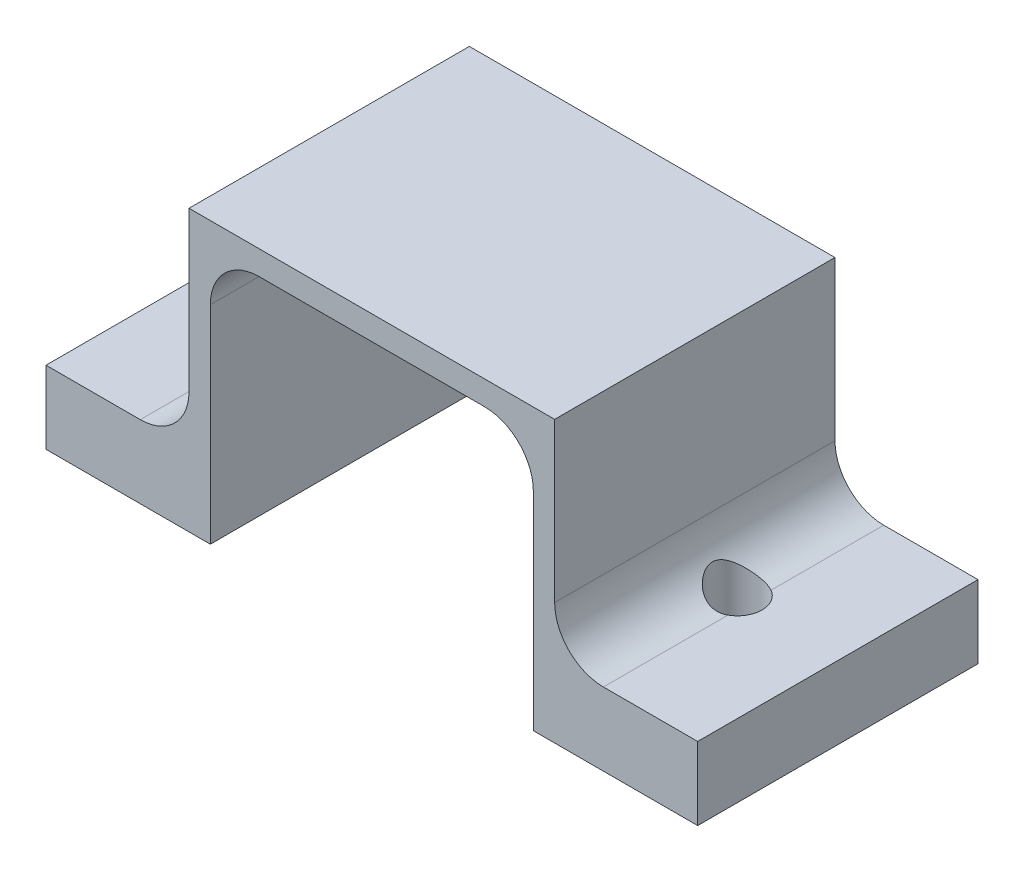
ISO-10303-21;
HEADER;
FILE_DESCRIPTION(('STEP AP214'),'2;1');
FILE_NAME('part.step','',(''),(''),'','','');
FILE_SCHEMA(('AUTOMOTIVE_DESIGN { 1 0 10303 214 1 1 1 1 }'));
ENDSEC;
DATA;
#1=APPLICATION_CONTEXT('core data for automotive mechanical design processes');
#2=APPLICATION_PROTOCOL_DEFINITION('international standard','automotive_design',2000,#1);
#3=PRODUCT_CONTEXT('',#1,'mechanical');
#4=PRODUCT('Part','Part','',(#3));
#5=PRODUCT_RELATED_PRODUCT_CATEGORY('part','',(#4));
#6=PRODUCT_DEFINITION_FORMATION('','',#4);
#7=PRODUCT_DEFINITION_CONTEXT('part definition',#1,'design');
#8=PRODUCT_DEFINITION('design','',#6,#7);
#9=PRODUCT_DEFINITION_SHAPE('','',#8);
#10=(LENGTH_UNIT() NAMED_UNIT(*) SI_UNIT(.MILLI.,.METRE.));
#11=(NAMED_UNIT(*) PLANE_ANGLE_UNIT() SI_UNIT($,.RADIAN.));
#12=(NAMED_UNIT(*) SI_UNIT($,.STERADIAN.) SOLID_ANGLE_UNIT());
#13=UNCERTAINTY_MEASURE_WITH_UNIT(LENGTH_MEASURE(1.E-05),#10,'distance_accuracy_value','');
#14=(GEOMETRIC_REPRESENTATION_CONTEXT(3) GLOBAL_UNCERTAINTY_ASSIGNED_CONTEXT((#13)) GLOBAL_UNIT_ASSIGNED_CONTEXT((#10,
#11,#12)) REPRESENTATION_CONTEXT('',''));
#15=CARTESIAN_POINT('',(0.,0.,0.));
#16=DIRECTION('',(0.,0.,1.));
#17=DIRECTION('',(1.,0.,0.));
#18=AXIS2_PLACEMENT_3D('',#15,#16,#17);
#19=CARTESIAN_POINT('',(4.62528628462516,6.5868047316279,11.5));
#20=DIRECTION('',(0.,0.,-1.));
#21=DIRECTION('',(-1.,0.,0.));
#22=AXIS2_PLACEMENT_3D('',#19,#20,#21);
#23=CYLINDRICAL_SURFACE('',#22,2.);
#24=CARTESIAN_POINT('',(4.62528628462516,6.5868047316279,0.));
#25=DIRECTION('',(0.,0.,1.));
#26=DIRECTION('',(1.,0.,0.));
#27=AXIS2_PLACEMENT_3D('',#24,#25,#26);
#28=CIRCLE('',#27,2.);
#29=CARTESIAN_POINT('',(6.62528628462516,6.5868047316279,0.));
#30=VERTEX_POINT('',#29);
#31=CARTESIAN_POINT('',(4.62528628462515,8.5868047316279,0.));
#32=VERTEX_POINT('',#31);
#33=EDGE_CURVE('E223',#30,#32,#28,.T.);
#34=ORIENTED_EDGE('',*,*,#33,.F.);
#35=DIRECTION('',(0.,0.,-1.));
#36=VECTOR('',#35,1.);
#37=CARTESIAN_POINT('',(6.62528628462516,6.5868047316279,11.5));
#38=LINE('',#37,#36);
#39=CARTESIAN_POINT('',(6.62528628462516,6.5868047316279,11.5));
#40=VERTEX_POINT('',#39);
#41=EDGE_CURVE('E48',#40,#30,#38,.T.);
#42=ORIENTED_EDGE('',*,*,#41,.F.);
#43=CARTESIAN_POINT('',(4.62528628462516,6.5868047316279,11.5));
#44=DIRECTION('',(0.,0.,1.));
#45=DIRECTION('',(1.,0.,0.));
#46=AXIS2_PLACEMENT_3D('',#43,#44,#45);
#47=CIRCLE('',#46,2.);
#48=CARTESIAN_POINT('',(4.62528628462515,8.5868047316279,11.5));
#49=VERTEX_POINT('',#48);
#50=EDGE_CURVE('E272',#40,#49,#47,.T.);
#51=ORIENTED_EDGE('',*,*,#50,.T.);
#52=DIRECTION('',(0.,0.,-1.));
#53=VECTOR('',#52,1.);
#54=CARTESIAN_POINT('',(4.62528628462515,8.5868047316279,11.5));
#55=LINE('',#54,#53);
#56=EDGE_CURVE('E228',#49,#32,#55,.T.);
#57=ORIENTED_EDGE('',*,*,#56,.T.);
#58=EDGE_LOOP('',(#34,#42,#51,#57));
#59=FACE_BOUND('',#58,.T.);
#60=ADVANCED_FACE('F35',(#59),#23,.F.);
#61=CARTESIAN_POINT('',(6.62528628462516,0.,11.5));
#62=DIRECTION('',(1.,0.,0.));
#63=DIRECTION('',(0.,1.,0.));
#64=AXIS2_PLACEMENT_3D('',#61,#62,#63);
#65=PLANE('',#64);
#66=DIRECTION('',(0.,-1.,0.));
#67=VECTOR('',#66,1.);
#68=CARTESIAN_POINT('',(6.62528628462516,0.,0.));
#69=LINE('',#68,#67);
#70=CARTESIAN_POINT('',(6.62528628462516,-1.92325581395349,0.));
#71=VERTEX_POINT('',#70);
#72=EDGE_CURVE('E212',#30,#71,#69,.T.);
#73=ORIENTED_EDGE('',*,*,#72,.T.);
#74=DIRECTION('',(0.,0.,-1.));
#75=VECTOR('',#74,1.);
#76=CARTESIAN_POINT('',(6.62528628462516,-1.92325581395349,11.5));
#77=LINE('',#76,#75);
#78=CARTESIAN_POINT('',(6.62528628462516,-1.92325581395349,11.5));
#79=VERTEX_POINT('',#78);
#80=EDGE_CURVE('E205',#79,#71,#77,.T.);
#81=ORIENTED_EDGE('',*,*,#80,.F.);
#82=DIRECTION('',(0.,-1.,0.));
#83=VECTOR('',#82,1.);
#84=CARTESIAN_POINT('',(6.62528628462516,0.,11.5));
#85=LINE('',#84,#83);
#86=EDGE_CURVE('E213',#40,#79,#85,.T.);
#87=ORIENTED_EDGE('',*,*,#86,.F.);
#88=ORIENTED_EDGE('',*,*,#41,.T.);
#89=EDGE_LOOP('',(#73,#81,#87,#88));
#90=FACE_BOUND('',#89,.T.);
#91=ADVANCED_FACE('F210',(#90),#65,.F.);
#92=CARTESIAN_POINT('',(0.,-1.92325581395349,11.5));
#93=DIRECTION('',(0.,1.,0.));
#94=DIRECTION('',(0.,0.,1.));
#95=AXIS2_PLACEMENT_3D('',#92,#93,#94);
#96=PLANE('',#95);
#97=CARTESIAN_POINT('',(9.,-1.9232558139535,5.50772032302288));
#98=DIRECTION('',(0.,1.,0.));
#99=DIRECTION('',(-1.,0.,0.));
#100=AXIS2_PLACEMENT_3D('',#97,#98,#99);
#101=CIRCLE('',#100,1.016);
#102=CARTESIAN_POINT('',(7.984,-1.9232558139535,5.50772032302288));
#103=VERTEX_POINT('',#102);
#104=EDGE_CURVE('E544',#103,#103,#101,.T.);
#105=ORIENTED_EDGE('',*,*,#104,.T.);
#106=EDGE_LOOP('',(#105));
#107=FACE_BOUND('',#106,.T.);
#108=DIRECTION('',(1.,0.,0.));
#109=VECTOR('',#108,1.);
#110=CARTESIAN_POINT('',(0.,-1.92325581395349,0.));
#111=LINE('',#110,#109);
#112=CARTESIAN_POINT('',(13.367366985854,-1.92325581395349,0.));
#113=VERTEX_POINT('',#112);
#114=EDGE_CURVE('E225',#71,#113,#111,.T.);
#115=ORIENTED_EDGE('',*,*,#114,.T.);
#116=DIRECTION('',(0.,0.,-1.));
#117=VECTOR('',#116,1.);
#118=CARTESIAN_POINT('',(13.367366985854,-1.92325581395349,11.5));
#119=LINE('',#118,#117);
#120=CARTESIAN_POINT('',(13.367366985854,-1.92325581395349,11.5));
#121=VERTEX_POINT('',#120);
#122=EDGE_CURVE('E202',#121,#113,#119,.T.);
#123=ORIENTED_EDGE('',*,*,#122,.F.);
#124=DIRECTION('',(1.,0.,0.));
#125=VECTOR('',#124,1.);
#126=CARTESIAN_POINT('',(0.,-1.92325581395349,11.5));
#127=LINE('',#126,#125);
#128=EDGE_CURVE('E326',#79,#121,#127,.T.);
#129=ORIENTED_EDGE('',*,*,#128,.F.);
#130=ORIENTED_EDGE('',*,*,#80,.T.);
#131=EDGE_LOOP('',(#115,#123,#129,#130));
#132=FACE_BOUND('',#131,.T.);
#133=ADVANCED_FACE('F373',(#107,#132),#96,.F.);
#134=CARTESIAN_POINT('',(13.367366985854,0.,11.5));
#135=DIRECTION('',(-1.,0.,0.));
#136=DIRECTION('',(0.,0.,1.));
#137=AXIS2_PLACEMENT_3D('',#134,#135,#136);
#138=PLANE('',#137);
#139=DIRECTION('',(0.,1.,0.));
#140=VECTOR('',#139,1.);
#141=CARTESIAN_POINT('',(13.367366985854,0.,0.));
#142=LINE('',#141,#140);
#143=CARTESIAN_POINT('',(13.367366985854,1.06674154127778,0.));
#144=VERTEX_POINT('',#143);
#145=EDGE_CURVE('E237',#113,#144,#142,.T.);
#146=ORIENTED_EDGE('',*,*,#145,.T.);
#147=DIRECTION('',(0.,0.,-1.));
#148=VECTOR('',#147,1.);
#149=CARTESIAN_POINT('',(13.367366985854,1.06674154127778,11.5));
#150=LINE('',#149,#148);
#151=CARTESIAN_POINT('',(13.367366985854,1.06674154127778,11.5));
#152=VERTEX_POINT('',#151);
#153=EDGE_CURVE('E199',#152,#144,#150,.T.);
#154=ORIENTED_EDGE('',*,*,#153,.F.);
#155=DIRECTION('',(0.,1.,0.));
#156=VECTOR('',#155,1.);
#157=CARTESIAN_POINT('',(13.367366985854,0.,11.5));
#158=LINE('',#157,#156);
#159=EDGE_CURVE('E324',#121,#152,#158,.T.);
#160=ORIENTED_EDGE('',*,*,#159,.F.);
#161=ORIENTED_EDGE('',*,*,#122,.T.);
#162=EDGE_LOOP('',(#146,#154,#160,#161));
#163=FACE_BOUND('',#162,.T.);
#164=ADVANCED_FACE('F377',(#163),#138,.F.);
#165=CARTESIAN_POINT('',(0.,1.06674154127777,11.5));
#166=DIRECTION('',(0.,-1.,0.));
#167=DIRECTION('',(1.,0.,0.));
#168=AXIS2_PLACEMENT_3D('',#165,#166,#167);
#169=PLANE('',#168);
#170=DIRECTION('',(0.,0.,-1.));
#171=VECTOR('',#170,1.);
#172=CARTESIAN_POINT('',(9.5,1.06674154127778,11.5));
#173=LINE('',#172,#171);
#174=CARTESIAN_POINT('',(9.5,1.06674154127778,4.62326795008243));
#175=VERTEX_POINT('',#174);
#176=CARTESIAN_POINT('',(9.5,1.06674154127778,0.));
#177=VERTEX_POINT('',#176);
#178=EDGE_CURVE('E195',#175,#177,#173,.T.);
#179=ORIENTED_EDGE('',*,*,#178,.F.);
#180=CARTESIAN_POINT('',(9.,1.06674154127778,5.50772032302288));
#181=DIRECTION('',(0.,-1.,0.));
#182=DIRECTION('',(1.,0.,0.));
#183=AXIS2_PLACEMENT_3D('',#180,#181,#182);
#184=CIRCLE('',#183,1.016);
#185=CARTESIAN_POINT('',(9.5,1.06674154127778,6.39217269596333));
#186=VERTEX_POINT('',#185);
#187=EDGE_CURVE('E54',#175,#186,#184,.T.);
#188=ORIENTED_EDGE('',*,*,#187,.T.);
#189=CARTESIAN_POINT('',(9.5,1.06674154127778,11.5));
#190=VERTEX_POINT('',#189);
#191=EDGE_CURVE('E196',#190,#186,#173,.T.);
#192=ORIENTED_EDGE('',*,*,#191,.F.);
#193=DIRECTION('',(-1.,0.,0.));
#194=VECTOR('',#193,1.);
#195=CARTESIAN_POINT('',(0.,1.06674154127777,11.5));
#196=LINE('',#195,#194);
#197=EDGE_CURVE('E322',#152,#190,#196,.T.);
#198=ORIENTED_EDGE('',*,*,#197,.F.);
#199=ORIENTED_EDGE('',*,*,#153,.T.);
#200=DIRECTION('',(-1.,0.,0.));
#201=VECTOR('',#200,1.);
#202=CARTESIAN_POINT('',(0.,1.06674154127777,0.));
#203=LINE('',#202,#201);
#204=EDGE_CURVE('E239',#144,#177,#203,.T.);
#205=ORIENTED_EDGE('',*,*,#204,.T.);
#206=EDGE_LOOP('',(#179,#188,#192,#198,#199,#205));
#207=FACE_BOUND('',#206,.T.);
#208=ADVANCED_FACE('F383',(#207),#169,.F.);
#209=CARTESIAN_POINT('',(9.5,3.06674154127778,11.5));
#210=DIRECTION('',(0.,0.,-1.));
#211=DIRECTION('',(-1.,0.,0.));
#212=AXIS2_PLACEMENT_3D('',#209,#210,#211);
#213=CYLINDRICAL_SURFACE('',#212,2.);
#214=ORIENTED_EDGE('',*,*,#191,.T.);
#215=CARTESIAN_POINT('',(9.5,1.06674154127778,6.39217269596333));
#216=CARTESIAN_POINT('',(9.47722805187101,1.06674040457487,6.40504694893287));
#217=CARTESIAN_POINT('',(9.45396665732978,1.06713106917481,6.41703478496705));
#218=CARTESIAN_POINT('',(9.40661357287032,1.0687824857209,6.43917354535688));
#219=CARTESIAN_POINT('',(9.38252181616436,1.07004330781148,6.44932432154168));
#220=CARTESIAN_POINT('',(9.30939337536247,1.07524901437059,6.4768603444416));
#221=CARTESIAN_POINT('',(9.25934880059081,1.0806159935207,6.49141643737248));
#222=CARTESIAN_POINT('',(9.15818794125962,1.09550223810473,6.512663714108));
#223=CARTESIAN_POINT('',(9.10707050242142,1.10502621965465,6.51934593305959));
#224=CARTESIAN_POINT('',(9.00535508404934,1.12817332699552,6.52498221294888));
#225=CARTESIAN_POINT('',(8.95475708685666,1.14179631295745,6.52393653747896));
#226=CARTESIAN_POINT('',(8.85489953978159,1.17290646668731,6.51456953580584));
#227=CARTESIAN_POINT('',(8.80565959275535,1.19043266279741,6.50617201900574));
#228=CARTESIAN_POINT('',(8.71007583285244,1.22862466628966,6.48272038096673));
#229=CARTESIAN_POINT('',(8.66373354745878,1.24929211019174,6.46766278211757));
#230=CARTESIAN_POINT('',(8.56922392726815,1.29565413874649,6.4294536914231));
#231=CARTESIAN_POINT('',(8.52151533458469,1.32165441804616,6.40554278752988));
#232=CARTESIAN_POINT('',(8.43111417224418,1.37551172987786,6.35117298274259));
#233=CARTESIAN_POINT('',(8.38842693787218,1.40337068892239,6.32070721266873));
#234=CARTESIAN_POINT('',(8.30161543533116,1.46450924584062,6.24815394357208));
#235=CARTESIAN_POINT('',(8.25848544743031,1.49790370358723,6.20497074141235));
#236=CARTESIAN_POINT('',(8.18015251481576,1.56321473262756,6.11092082138043));
#237=CARTESIAN_POINT('',(8.14494604551504,1.59513195599466,6.06005753669955));
#238=CARTESIAN_POINT('',(8.09264532858068,1.64538485053041,5.96696122011709));
#239=CARTESIAN_POINT('',(8.07327870574563,1.66493612506622,5.92666254522367));
#240=CARTESIAN_POINT('',(8.03962870954202,1.70002814446385,5.84237322398303));
#241=CARTESIAN_POINT('',(8.02533471955893,1.71557724657716,5.79839052948975));
#242=CARTESIAN_POINT('',(8.00485823560123,1.73830600305565,5.71601506000442));
#243=CARTESIAN_POINT('',(7.99764525563686,1.74651940063158,5.6781704519578));
#244=CARTESIAN_POINT('',(7.98756621986928,1.75807605658074,5.60118535397957));
#245=CARTESIAN_POINT('',(7.98469513023163,1.761424954505,5.56204641854876));
#246=CARTESIAN_POINT('',(7.98352803066278,1.76278060342026,5.48350870892204));
#247=CARTESIAN_POINT('',(7.98524299627919,1.76077453870131,5.44410953688641));
#248=CARTESIAN_POINT('',(7.99312239269218,1.75169265831385,5.3663493820449));
#249=CARTESIAN_POINT('',(7.99929148671209,1.74461152939409,5.32798953105478));
#250=CARTESIAN_POINT('',(8.01774811705835,1.723922069376,5.24361713836458));
#251=CARTESIAN_POINT('',(8.03119824152044,1.70910628987463,5.19816174819894));
#252=CARTESIAN_POINT('',(8.06349428338611,1.67497895402571,5.11100170400572));
#253=CARTESIAN_POINT('',(8.08235316978816,1.65565661300701,5.06930638547781));
#254=CARTESIAN_POINT('',(8.13308404601854,1.60618224683764,4.97419017164733));
#255=CARTESIAN_POINT('',(8.16715677912291,1.5747600821419,4.92260869430731));
#256=CARTESIAN_POINT('',(8.24326206349779,1.51010537019465,4.82702953854091));
#257=CARTESIAN_POINT('',(8.285303185472,1.47687090132226,4.78304012428949));
#258=CARTESIAN_POINT('',(8.37766026148072,1.41034334685811,4.70225070378857));
#259=CARTESIAN_POINT('',(8.42811855371673,1.37706119815816,4.66560356580001));
#260=CARTESIAN_POINT('',(8.53612556754695,1.31321145885045,4.60162834220232));
#261=CARTESIAN_POINT('',(8.59366379767523,1.28263996440363,4.57428668831689));
#262=CARTESIAN_POINT('',(8.70350598264992,1.23137862873014,4.5345342079283));
#263=CARTESIAN_POINT('',(8.75478049879228,1.2099096115549,4.52028852908409));
#264=CARTESIAN_POINT('',(8.86037370125265,1.17094744061318,4.49992839029816));
#265=CARTESIAN_POINT('',(8.91468999703956,1.15345121781318,4.49380763591368));
#266=CARTESIAN_POINT('',(9.02520369508073,1.12306742385737,4.49052215445921));
#267=CARTESIAN_POINT('',(9.08140962262267,1.11020506896996,4.49340562867738));
#268=CARTESIAN_POINT('',(9.19347568461273,1.08955093969516,4.50871386063913));
#269=CARTESIAN_POINT('',(9.2493359360767,1.0817573446382,4.52113518894021));
#270=CARTESIAN_POINT('',(9.33789871316593,1.07302705829679,4.54889068306748));
#271=CARTESIAN_POINT('',(9.37138932224676,1.07061285438674,4.56135932473063));
#272=CARTESIAN_POINT('',(9.4368936261643,1.06746730035939,4.58975767210488));
#273=CARTESIAN_POINT('',(9.46890945591181,1.06673343760947,4.6056821711437));
#274=CARTESIAN_POINT('',(9.5,1.06674154127778,4.62326795008243));
#275=B_SPLINE_CURVE_WITH_KNOTS('',3,(#215,#216,#217,#218,#219,#220,#221,#222,#223,#224,#225,
#226,#227,#228,#229,#230,#231,#232,#233,#234,#235,#236,#237,#238,#239,#240,#241,#242,#243,#244,
#245,#246,#247,#248,#249,#250,#251,#252,#253,#254,#255,#256,#257,#258,#259,#260,#261,#262,#263,
#264,#265,#266,#267,#268,#269,#270,#271,#272,#273,#274),.UNSPECIFIED.,.F.,.F.,(4,2,2,2,2,2,2,2,
2,2,2,2,2,2,2,2,2,2,2,2,2,2,2,2,2,2,2,2,2,4),(0.,0.0784337308048021,0.156873784984739,
0.313227992604019,0.469760046892622,0.626286762021119,0.784455099006358,0.942706122416788,
1.12012363861171,1.2977279932422,1.50559176028224,1.71336288055514,1.85932076123321,
2.00497133671186,2.12265631286733,2.24020474433206,2.35803474945352,2.47598829521225,
2.62416045952992,2.77269092110477,2.97964864338609,3.18683024327894,3.3979573946252,
3.60877537034955,3.78021969842125,3.9515311295603,4.12376119129954,4.29592935476835,
4.40316273399298,4.51023566095661),.UNSPECIFIED.);
#276=EDGE_CURVE('E11',#186,#175,#275,.T.);
#277=ORIENTED_EDGE('',*,*,#276,.T.);
#278=ORIENTED_EDGE('',*,*,#178,.T.);
#279=CARTESIAN_POINT('',(9.5,3.06674154127778,0.));
#280=DIRECTION('',(0.,0.,1.));
#281=DIRECTION('',(1.,0.,0.));
#282=AXIS2_PLACEMENT_3D('',#279,#280,#281);
#283=CIRCLE('',#282,2.);
#284=CARTESIAN_POINT('',(7.5,3.06674154127778,0.));
#285=VERTEX_POINT('',#284);
#286=EDGE_CURVE('E242',#177,#285,#283,.F.);
#287=ORIENTED_EDGE('',*,*,#286,.T.);
#288=DIRECTION('',(0.,0.,-1.));
#289=VECTOR('',#288,1.);
#290=CARTESIAN_POINT('',(7.5,3.06674154127778,11.5));
#291=LINE('',#290,#289);
#292=CARTESIAN_POINT('',(7.5,3.06674154127778,11.5));
#293=VERTEX_POINT('',#292);
#294=EDGE_CURVE('E192',#293,#285,#291,.T.);
#295=ORIENTED_EDGE('',*,*,#294,.F.);
#296=CARTESIAN_POINT('',(9.5,3.06674154127778,11.5));
#297=DIRECTION('',(0.,0.,1.));
#298=DIRECTION('',(1.,0.,0.));
#299=AXIS2_PLACEMENT_3D('',#296,#297,#298);
#300=CIRCLE('',#299,2.);
#301=EDGE_CURVE('E320',#190,#293,#300,.F.);
#302=ORIENTED_EDGE('',*,*,#301,.F.);
#303=EDGE_LOOP('',(#214,#277,#278,#287,#295,#302));
#304=FACE_BOUND('',#303,.T.);
#305=ADVANCED_FACE('F386',(#304),#213,.F.);
#306=CARTESIAN_POINT('',(7.5,0.,11.5));
#307=DIRECTION('',(-1.,0.,0.));
#308=DIRECTION('',(0.,0.,1.));
#309=AXIS2_PLACEMENT_3D('',#306,#307,#308);
#310=PLANE('',#309);
#311=DIRECTION('',(0.,1.,0.));
#312=VECTOR('',#311,1.);
#313=CARTESIAN_POINT('',(7.5,0.,0.));
#314=LINE('',#313,#312);
#315=CARTESIAN_POINT('',(7.5,9.57674418604651,0.));
#316=VERTEX_POINT('',#315);
#317=EDGE_CURVE('E244',#285,#316,#314,.T.);
#318=ORIENTED_EDGE('',*,*,#317,.T.);
#319=DIRECTION('',(0.,0.,-1.));
#320=VECTOR('',#319,1.);
#321=CARTESIAN_POINT('',(7.5,9.57674418604651,11.5));
#322=LINE('',#321,#320);
#323=CARTESIAN_POINT('',(7.5,9.57674418604651,11.5));
#324=VERTEX_POINT('',#323);
#325=EDGE_CURVE('E190',#324,#316,#322,.T.);
#326=ORIENTED_EDGE('',*,*,#325,.F.);
#327=DIRECTION('',(0.,1.,0.));
#328=VECTOR('',#327,1.);
#329=CARTESIAN_POINT('',(7.5,0.,11.5));
#330=LINE('',#329,#328);
#331=EDGE_CURVE('E318',#293,#324,#330,.T.);
#332=ORIENTED_EDGE('',*,*,#331,.F.);
#333=ORIENTED_EDGE('',*,*,#294,.T.);
#334=EDGE_LOOP('',(#318,#326,#332,#333));
#335=FACE_BOUND('',#334,.T.);
#336=ADVANCED_FACE('F391',(#335),#310,.F.);
#337=CARTESIAN_POINT('',(0.,9.57674418604651,11.5));
#338=DIRECTION('',(0.,1.,0.));
#339=DIRECTION('',(0.,0.,1.));
#340=AXIS2_PLACEMENT_3D('',#337,#338,#339);
#341=PLANE('',#340);
#342=DIRECTION('',(1.,0.,0.));
#343=VECTOR('',#342,1.);
#344=CARTESIAN_POINT('',(0.,9.57674418604651,0.));
#345=LINE('',#344,#343);
#346=CARTESIAN_POINT('',(-7.5,9.57674418604651,0.));
#347=VERTEX_POINT('',#346);
#348=EDGE_CURVE('E247',#347,#316,#345,.T.);
#349=ORIENTED_EDGE('',*,*,#348,.F.);
#350=DIRECTION('',(0.,0.,-1.));
#351=VECTOR('',#350,1.);
#352=CARTESIAN_POINT('',(-7.5,9.57674418604651,11.5));
#353=LINE('',#352,#351);
#354=CARTESIAN_POINT('',(-7.5,9.57674418604651,11.5));
#355=VERTEX_POINT('',#354);
#356=EDGE_CURVE('E183',#355,#347,#353,.T.);
#357=ORIENTED_EDGE('',*,*,#356,.F.);
#358=DIRECTION('',(1.,0.,0.));
#359=VECTOR('',#358,1.);
#360=CARTESIAN_POINT('',(0.,9.57674418604651,11.5));
#361=LINE('',#360,#359);
#362=EDGE_CURVE('E315',#355,#324,#361,.T.);
#363=ORIENTED_EDGE('',*,*,#362,.T.);
#364=ORIENTED_EDGE('',*,*,#325,.T.);
#365=EDGE_LOOP('',(#349,#357,#363,#364));
#366=FACE_BOUND('',#365,.T.);
#367=ADVANCED_FACE('F395',(#366),#341,.T.);
#368=CARTESIAN_POINT('',(-7.5,0.,11.5));
#369=DIRECTION('',(-1.,0.,0.));
#370=DIRECTION('',(0.,0.,1.));
#371=AXIS2_PLACEMENT_3D('',#368,#369,#370);
#372=PLANE('',#371);
#373=DIRECTION('',(0.,1.,0.));
#374=VECTOR('',#373,1.);
#375=CARTESIAN_POINT('',(-7.5,0.,0.));
#376=LINE('',#375,#374);
#377=CARTESIAN_POINT('',(-7.5,3.06674154127778,0.));
#378=VERTEX_POINT('',#377);
#379=EDGE_CURVE('E250',#378,#347,#376,.T.);
#380=ORIENTED_EDGE('',*,*,#379,.F.);
#381=DIRECTION('',(0.,0.,-1.));
#382=VECTOR('',#381,1.);
#383=CARTESIAN_POINT('',(-7.5,3.06674154127778,11.5));
#384=LINE('',#383,#382);
#385=CARTESIAN_POINT('',(-7.5,3.06674154127778,11.5));
#386=VERTEX_POINT('',#385);
#387=EDGE_CURVE('E181',#386,#378,#384,.T.);
#388=ORIENTED_EDGE('',*,*,#387,.F.);
#389=DIRECTION('',(0.,1.,0.));
#390=VECTOR('',#389,1.);
#391=CARTESIAN_POINT('',(-7.5,0.,11.5));
#392=LINE('',#391,#390);
#393=EDGE_CURVE('E312',#386,#355,#392,.T.);
#394=ORIENTED_EDGE('',*,*,#393,.T.);
#395=ORIENTED_EDGE('',*,*,#356,.T.);
#396=EDGE_LOOP('',(#380,#388,#394,#395));
#397=FACE_BOUND('',#396,.T.);
#398=ADVANCED_FACE('F368',(#397),#372,.T.);
#399=CARTESIAN_POINT('',(-9.5,3.06674154127778,11.5));
#400=DIRECTION('',(0.,0.,-1.));
#401=DIRECTION('',(-1.,0.,0.));
#402=AXIS2_PLACEMENT_3D('',#399,#400,#401);
#403=CYLINDRICAL_SURFACE('',#402,2.);
#404=CARTESIAN_POINT('',(-9.5,1.06674154127778,6.39217269596333));
#405=CARTESIAN_POINT('',(-9.47722805187101,1.06674040457487,6.40504694893288));
#406=CARTESIAN_POINT('',(-9.45396665732978,1.06713106917481,6.41703478496706));
#407=CARTESIAN_POINT('',(-9.40661357287032,1.0687824857209,6.43917354535689));
#408=CARTESIAN_POINT('',(-9.38252181616436,1.07004330781148,6.44932432154168));
#409=CARTESIAN_POINT('',(-9.30939337536248,1.07524901437059,6.4768603444416));
#410=CARTESIAN_POINT('',(-9.25934880059081,1.0806159935207,6.49141643737248));
#411=CARTESIAN_POINT('',(-9.15818794125962,1.09550223810473,6.512663714108));
#412=CARTESIAN_POINT('',(-9.10707050242142,1.10502621965465,6.5193459330596));
#413=CARTESIAN_POINT('',(-9.00535508404934,1.12817332699552,6.52498221294889));
#414=CARTESIAN_POINT('',(-8.95475708685666,1.14179631295745,6.52393653747896));
#415=CARTESIAN_POINT('',(-8.85489953978159,1.17290646668731,6.51456953580584));
#416=CARTESIAN_POINT('',(-8.80565959275535,1.19043266279741,6.50617201900574));
#417=CARTESIAN_POINT('',(-8.71007583285244,1.22862466628966,6.48272038096673));
#418=CARTESIAN_POINT('',(-8.66373354745878,1.24929211019174,6.46766278211757));
#419=CARTESIAN_POINT('',(-8.56922392726815,1.29565413874649,6.4294536914231));
#420=CARTESIAN_POINT('',(-8.52151533458469,1.32165441804616,6.40554278752988));
#421=CARTESIAN_POINT('',(-8.43111417224418,1.37551172987786,6.35117298274259));
#422=CARTESIAN_POINT('',(-8.38842693787218,1.40337068892239,6.32070721266873));
#423=CARTESIAN_POINT('',(-8.30161543533116,1.46450924584062,6.24815394357209));
#424=CARTESIAN_POINT('',(-8.25848544743031,1.49790370358723,6.20497074141235));
#425=CARTESIAN_POINT('',(-8.18015251481576,1.56321473262756,6.11092082138043));
#426=CARTESIAN_POINT('',(-8.14494604551504,1.59513195599466,6.06005753669955));
#427=CARTESIAN_POINT('',(-8.09264532858068,1.64538485053041,5.96696122011709));
#428=CARTESIAN_POINT('',(-8.07327870574563,1.66493612506622,5.92666254522367));
#429=CARTESIAN_POINT('',(-8.03962870954202,1.70002814446385,5.84237322398304));
#430=CARTESIAN_POINT('',(-8.02533471955893,1.71557724657716,5.79839052948975));
#431=CARTESIAN_POINT('',(-8.00485823560123,1.73830600305565,5.71601506000442));
#432=CARTESIAN_POINT('',(-7.99764525563686,1.74651940063158,5.6781704519578));
#433=CARTESIAN_POINT('',(-7.98756621986927,1.75807605658074,5.60118535397957));
#434=CARTESIAN_POINT('',(-7.98469513023163,1.761424954505,5.56204641854876));
#435=CARTESIAN_POINT('',(-7.98352803066278,1.76278060342026,5.48350870892204));
#436=CARTESIAN_POINT('',(-7.98524299627919,1.76077453870131,5.44410953688641));
#437=CARTESIAN_POINT('',(-7.99312239269219,1.75169265831385,5.3663493820449));
#438=CARTESIAN_POINT('',(-7.99929148671209,1.74461152939409,5.32798953105479));
#439=CARTESIAN_POINT('',(-8.01774811705835,1.723922069376,5.24361713836458));
#440=CARTESIAN_POINT('',(-8.03119824152044,1.70910628987463,5.19816174819895));
#441=CARTESIAN_POINT('',(-8.06349428338611,1.67497895402571,5.11100170400572));
#442=CARTESIAN_POINT('',(-8.08235316978816,1.65565661300701,5.06930638547782));
#443=CARTESIAN_POINT('',(-8.13308404601854,1.60618224683764,4.97419017164733));
#444=CARTESIAN_POINT('',(-8.16715677912291,1.5747600821419,4.92260869430732));
#445=CARTESIAN_POINT('',(-8.24326206349779,1.51010537019465,4.82702953854091));
#446=CARTESIAN_POINT('',(-8.285303185472,1.47687090132226,4.7830401242895));
#447=CARTESIAN_POINT('',(-8.37766026148072,1.41034334685811,4.70225070378857));
#448=CARTESIAN_POINT('',(-8.42811855371673,1.37706119815816,4.66560356580002));
#449=CARTESIAN_POINT('',(-8.53612556754695,1.31321145885045,4.60162834220232));
#450=CARTESIAN_POINT('',(-8.59366379767523,1.28263996440363,4.57428668831689));
#451=CARTESIAN_POINT('',(-8.70350598264992,1.23137862873014,4.5345342079283));
#452=CARTESIAN_POINT('',(-8.75478049879228,1.2099096115549,4.52028852908409));
#453=CARTESIAN_POINT('',(-8.86037370125265,1.17094744061318,4.49992839029817));
#454=CARTESIAN_POINT('',(-8.91468999703956,1.15345121781318,4.49380763591369));
#455=CARTESIAN_POINT('',(-9.02520369508073,1.12306742385737,4.49052215445922));
#456=CARTESIAN_POINT('',(-9.08140962262267,1.11020506896996,4.49340562867739));
#457=CARTESIAN_POINT('',(-9.19347568461273,1.08955093969516,4.50871386063913));
#458=CARTESIAN_POINT('',(-9.24933593607671,1.0817573446382,4.52113518894021));
#459=CARTESIAN_POINT('',(-9.33789871316594,1.07302705829679,4.54889068306748));
#460=CARTESIAN_POINT('',(-9.37138932224677,1.07061285438674,4.56135932473064));
#461=CARTESIAN_POINT('',(-9.43689362616431,1.06746730035939,4.58975767210489));
#462=CARTESIAN_POINT('',(-9.46890945591181,1.06673343760947,4.6056821711437));
#463=CARTESIAN_POINT('',(-9.5,1.06674154127778,4.62326795008243));
#464=B_SPLINE_CURVE_WITH_KNOTS('',3,(#404,#405,#406,#407,#408,#409,#410,#411,#412,#413,#414,
#415,#416,#417,#418,#419,#420,#421,#422,#423,#424,#425,#426,#427,#428,#429,#430,#431,#432,#433,
#434,#435,#436,#437,#438,#439,#440,#441,#442,#443,#444,#445,#446,#447,#448,#449,#450,#451,#452,
#453,#454,#455,#456,#457,#458,#459,#460,#461,#462,#463),.UNSPECIFIED.,.F.,.F.,(4,2,2,2,2,2,2,2,
2,2,2,2,2,2,2,2,2,2,2,2,2,2,2,2,2,2,2,2,2,4),(0.,0.0784337308048005,0.156873784984738,
0.313227992604019,0.469760046892622,0.626286762021119,0.784455099006358,0.942706122416789,
1.12012363861171,1.2977279932422,1.50559176028225,1.71336288055514,1.85932076123321,
2.00497133671186,2.12265631286733,2.24020474433205,2.35803474945352,2.47598829521225,
2.62416045952992,2.77269092110477,2.97964864338609,3.18683024327894,3.3979573946252,
3.60877537034955,3.78021969842125,3.9515311295603,4.12376119129954,4.29592935476835,
4.40316273399298,4.5102356609566),.UNSPECIFIED.);
#465=CARTESIAN_POINT('',(-9.5,1.06674154127778,6.39217269596333));
#466=VERTEX_POINT('',#465);
#467=CARTESIAN_POINT('',(-9.5,1.06674154127778,4.62326795008243));
#468=VERTEX_POINT('',#467);
#469=EDGE_CURVE('E60',#466,#468,#464,.T.);
#470=ORIENTED_EDGE('',*,*,#469,.F.);
#471=DIRECTION('',(0.,0.,-1.));
#472=VECTOR('',#471,1.);
#473=CARTESIAN_POINT('',(-9.5,1.06674154127778,11.5));
#474=LINE('',#473,#472);
#475=CARTESIAN_POINT('',(-9.5,1.06674154127778,11.5));
#476=VERTEX_POINT('',#475);
#477=EDGE_CURVE('E172',#476,#466,#474,.T.);
#478=ORIENTED_EDGE('',*,*,#477,.F.);
#479=CARTESIAN_POINT('',(-9.5,3.06674154127778,11.5));
#480=DIRECTION('',(0.,0.,1.));
#481=DIRECTION('',(1.,0.,0.));
#482=AXIS2_PLACEMENT_3D('',#479,#480,#481);
#483=CIRCLE('',#482,2.);
#484=EDGE_CURVE('E310',#476,#386,#483,.T.);
#485=ORIENTED_EDGE('',*,*,#484,.T.);
#486=ORIENTED_EDGE('',*,*,#387,.T.);
#487=CARTESIAN_POINT('',(-9.5,3.06674154127778,0.));
#488=DIRECTION('',(0.,0.,1.));
#489=DIRECTION('',(1.,0.,0.));
#490=AXIS2_PLACEMENT_3D('',#487,#488,#489);
#491=CIRCLE('',#490,2.);
#492=CARTESIAN_POINT('',(-9.5,1.06674154127778,0.));
#493=VERTEX_POINT('',#492);
#494=EDGE_CURVE('E253',#493,#378,#491,.T.);
#495=ORIENTED_EDGE('',*,*,#494,.F.);
#496=EDGE_CURVE('E175',#468,#493,#474,.T.);
#497=ORIENTED_EDGE('',*,*,#496,.F.);
#498=EDGE_LOOP('',(#470,#478,#485,#486,#495,#497));
#499=FACE_BOUND('',#498,.T.);
#500=ADVANCED_FACE('F170',(#499),#403,.F.);
#501=CARTESIAN_POINT('',(0.,1.06674154127777,11.5));
#502=DIRECTION('',(0.,1.,0.));
#503=DIRECTION('',(-1.,0.,0.));
#504=AXIS2_PLACEMENT_3D('',#501,#502,#503);
#505=PLANE('',#504);
#506=CARTESIAN_POINT('',(-9.,1.06674154127778,5.50772032302288));
#507=DIRECTION('',(0.,1.,0.));
#508=DIRECTION('',(-1.,0.,0.));
#509=AXIS2_PLACEMENT_3D('',#506,#507,#508);
#510=CIRCLE('',#509,1.016);
#511=EDGE_CURVE('E161',#468,#466,#510,.T.);
#512=ORIENTED_EDGE('',*,*,#511,.F.);
#513=ORIENTED_EDGE('',*,*,#496,.T.);
#514=DIRECTION('',(1.,0.,0.));
#515=VECTOR('',#514,1.);
#516=CARTESIAN_POINT('',(0.,1.06674154127777,0.));
#517=LINE('',#516,#515);
#518=CARTESIAN_POINT('',(-13.367366985854,1.06674154127778,0.));
#519=VERTEX_POINT('',#518);
#520=EDGE_CURVE('E256',#519,#493,#517,.T.);
#521=ORIENTED_EDGE('',*,*,#520,.F.);
#522=DIRECTION('',(0.,0.,-1.));
#523=VECTOR('',#522,1.);
#524=CARTESIAN_POINT('',(-13.367366985854,1.06674154127778,11.5));
#525=LINE('',#524,#523);
#526=CARTESIAN_POINT('',(-13.367366985854,1.06674154127778,11.5));
#527=VERTEX_POINT('',#526);
#528=EDGE_CURVE('E185',#527,#519,#525,.T.);
#529=ORIENTED_EDGE('',*,*,#528,.F.);
#530=DIRECTION('',(1.,0.,0.));
#531=VECTOR('',#530,1.);
#532=CARTESIAN_POINT('',(0.,1.06674154127777,11.5));
#533=LINE('',#532,#531);
#534=EDGE_CURVE('E180',#527,#476,#533,.T.);
#535=ORIENTED_EDGE('',*,*,#534,.T.);
#536=ORIENTED_EDGE('',*,*,#477,.T.);
#537=EDGE_LOOP('',(#512,#513,#521,#529,#535,#536));
#538=FACE_BOUND('',#537,.T.);
#539=ADVANCED_FACE('F178',(#538),#505,.T.);
#540=CARTESIAN_POINT('',(-13.367366985854,0.,11.5));
#541=DIRECTION('',(-1.,0.,0.));
#542=DIRECTION('',(0.,0.,1.));
#543=AXIS2_PLACEMENT_3D('',#540,#541,#542);
#544=PLANE('',#543);
#545=DIRECTION('',(0.,1.,0.));
#546=VECTOR('',#545,1.);
#547=CARTESIAN_POINT('',(-13.367366985854,0.,0.));
#548=LINE('',#547,#546);
#549=CARTESIAN_POINT('',(-13.367366985854,-1.92325581395349,0.));
#550=VERTEX_POINT('',#549);
#551=EDGE_CURVE('E259',#550,#519,#548,.T.);
#552=ORIENTED_EDGE('',*,*,#551,.F.);
#553=DIRECTION('',(0.,0.,-1.));
#554=VECTOR('',#553,1.);
#555=CARTESIAN_POINT('',(-13.367366985854,-1.92325581395349,11.5));
#556=LINE('',#555,#554);
#557=CARTESIAN_POINT('',(-13.367366985854,-1.92325581395349,11.5));
#558=VERTEX_POINT('',#557);
#559=EDGE_CURVE('E280',#558,#550,#556,.T.);
#560=ORIENTED_EDGE('',*,*,#559,.F.);
#561=DIRECTION('',(0.,1.,0.));
#562=VECTOR('',#561,1.);
#563=CARTESIAN_POINT('',(-13.367366985854,0.,11.5));
#564=LINE('',#563,#562);
#565=EDGE_CURVE('E290',#558,#527,#564,.T.);
#566=ORIENTED_EDGE('',*,*,#565,.T.);
#567=ORIENTED_EDGE('',*,*,#528,.T.);
#568=EDGE_LOOP('',(#552,#560,#566,#567));
#569=FACE_BOUND('',#568,.T.);
#570=ADVANCED_FACE('F288',(#569),#544,.T.);
#571=CARTESIAN_POINT('',(0.,-1.92325581395349,11.5));
#572=DIRECTION('',(0.,-1.,0.));
#573=DIRECTION('',(0.,0.,-1.));
#574=AXIS2_PLACEMENT_3D('',#571,#572,#573);
#575=PLANE('',#574);
#576=CARTESIAN_POINT('',(-9.,-1.92325581395349,5.50772032302288));
#577=DIRECTION('',(0.,1.,0.));
#578=DIRECTION('',(-1.,0.,0.));
#579=AXIS2_PLACEMENT_3D('',#576,#577,#578);
#580=CIRCLE('',#579,1.016);
#581=CARTESIAN_POINT('',(-10.016,-1.92325581395349,5.50772032302288));
#582=VERTEX_POINT('',#581);
#583=EDGE_CURVE('E167',#582,#582,#580,.T.);
#584=ORIENTED_EDGE('',*,*,#583,.T.);
#585=EDGE_LOOP('',(#584));
#586=FACE_BOUND('',#585,.T.);
#587=DIRECTION('',(-1.,0.,0.));
#588=VECTOR('',#587,1.);
#589=CARTESIAN_POINT('',(0.,-1.92325581395349,0.));
#590=LINE('',#589,#588);
#591=CARTESIAN_POINT('',(-6.62528628462516,-1.92325581395349,0.));
#592=VERTEX_POINT('',#591);
#593=EDGE_CURVE('E262',#592,#550,#590,.T.);
#594=ORIENTED_EDGE('',*,*,#593,.F.);
#595=DIRECTION('',(0.,0.,-1.));
#596=VECTOR('',#595,1.);
#597=CARTESIAN_POINT('',(-6.62528628462516,-1.92325581395349,11.5));
#598=LINE('',#597,#596);
#599=CARTESIAN_POINT('',(-6.62528628462516,-1.92325581395349,11.5));
#600=VERTEX_POINT('',#599);
#601=EDGE_CURVE('E279',#600,#592,#598,.T.);
#602=ORIENTED_EDGE('',*,*,#601,.F.);
#603=DIRECTION('',(-1.,0.,0.));
#604=VECTOR('',#603,1.);
#605=CARTESIAN_POINT('',(0.,-1.92325581395349,11.5));
#606=LINE('',#605,#604);
#607=EDGE_CURVE('E295',#600,#558,#606,.T.);
#608=ORIENTED_EDGE('',*,*,#607,.T.);
#609=ORIENTED_EDGE('',*,*,#559,.T.);
#610=EDGE_LOOP('',(#594,#602,#608,#609));
#611=FACE_BOUND('',#610,.T.);
#612=ADVANCED_FACE('F293',(#586,#611),#575,.T.);
#613=CARTESIAN_POINT('',(-6.62528628462516,0.,11.5));
#614=DIRECTION('',(1.,0.,0.));
#615=DIRECTION('',(0.,1.,0.));
#616=AXIS2_PLACEMENT_3D('',#613,#614,#615);
#617=PLANE('',#616);
#618=DIRECTION('',(0.,-1.,0.));
#619=VECTOR('',#618,1.);
#620=CARTESIAN_POINT('',(-6.62528628462516,0.,0.));
#621=LINE('',#620,#619);
#622=CARTESIAN_POINT('',(-6.62528628462516,6.5868047316279,0.));
#623=VERTEX_POINT('',#622);
#624=EDGE_CURVE('E265',#623,#592,#621,.T.);
#625=ORIENTED_EDGE('',*,*,#624,.F.);
#626=DIRECTION('',(0.,0.,-1.));
#627=VECTOR('',#626,1.);
#628=CARTESIAN_POINT('',(-6.62528628462516,6.5868047316279,11.5));
#629=LINE('',#628,#627);
#630=CARTESIAN_POINT('',(-6.62528628462516,6.5868047316279,11.5));
#631=VERTEX_POINT('',#630);
#632=EDGE_CURVE('E277',#631,#623,#629,.T.);
#633=ORIENTED_EDGE('',*,*,#632,.F.);
#634=DIRECTION('',(0.,-1.,0.));
#635=VECTOR('',#634,1.);
#636=CARTESIAN_POINT('',(-6.62528628462516,0.,11.5));
#637=LINE('',#636,#635);
#638=EDGE_CURVE('E301',#631,#600,#637,.T.);
#639=ORIENTED_EDGE('',*,*,#638,.T.);
#640=ORIENTED_EDGE('',*,*,#601,.T.);
#641=EDGE_LOOP('',(#625,#633,#639,#640));
#642=FACE_BOUND('',#641,.T.);
#643=ADVANCED_FACE('F303',(#642),#617,.T.);
#644=CARTESIAN_POINT('',(-4.62528628462516,6.5868047316279,11.5));
#645=DIRECTION('',(0.,0.,-1.));
#646=DIRECTION('',(-1.,0.,0.));
#647=AXIS2_PLACEMENT_3D('',#644,#645,#646);
#648=CYLINDRICAL_SURFACE('',#647,2.);
#649=CARTESIAN_POINT('',(-4.62528628462516,6.5868047316279,0.));
#650=DIRECTION('',(0.,0.,1.));
#651=DIRECTION('',(1.,0.,0.));
#652=AXIS2_PLACEMENT_3D('',#649,#650,#651);
#653=CIRCLE('',#652,2.);
#654=CARTESIAN_POINT('',(-4.62528628462515,8.5868047316279,0.));
#655=VERTEX_POINT('',#654);
#656=EDGE_CURVE('E268',#623,#655,#653,.F.);
#657=ORIENTED_EDGE('',*,*,#656,.T.);
#658=DIRECTION('',(0.,0.,-1.));
#659=VECTOR('',#658,1.);
#660=CARTESIAN_POINT('',(-4.62528628462515,8.5868047316279,11.5));
#661=LINE('',#660,#659);
#662=CARTESIAN_POINT('',(-4.62528628462515,8.5868047316279,11.5));
#663=VERTEX_POINT('',#662);
#664=EDGE_CURVE('E274',#663,#655,#661,.T.);
#665=ORIENTED_EDGE('',*,*,#664,.F.);
#666=CARTESIAN_POINT('',(-4.62528628462516,6.5868047316279,11.5));
#667=DIRECTION('',(0.,0.,1.));
#668=DIRECTION('',(1.,0.,0.));
#669=AXIS2_PLACEMENT_3D('',#666,#667,#668);
#670=CIRCLE('',#669,2.);
#671=EDGE_CURVE('E305',#631,#663,#670,.F.);
#672=ORIENTED_EDGE('',*,*,#671,.F.);
#673=ORIENTED_EDGE('',*,*,#632,.T.);
#674=EDGE_LOOP('',(#657,#665,#672,#673));
#675=FACE_BOUND('',#674,.T.);
#676=ADVANCED_FACE('F353',(#675),#648,.F.);
#677=CARTESIAN_POINT('',(0.,8.5868047316279,11.5));
#678=DIRECTION('',(0.,1.,0.));
#679=DIRECTION('',(0.,0.,1.));
#680=AXIS2_PLACEMENT_3D('',#677,#678,#679);
#681=PLANE('',#680);
#682=DIRECTION('',(1.,0.,0.));
#683=VECTOR('',#682,1.);
#684=CARTESIAN_POINT('',(0.,8.5868047316279,0.));
#685=LINE('',#684,#683);
#686=EDGE_CURVE('E270',#655,#32,#685,.T.);
#687=ORIENTED_EDGE('',*,*,#686,.T.);
#688=ORIENTED_EDGE('',*,*,#56,.F.);
#689=DIRECTION('',(1.,0.,0.));
#690=VECTOR('',#689,1.);
#691=CARTESIAN_POINT('',(0.,8.5868047316279,11.5));
#692=LINE('',#691,#690);
#693=EDGE_CURVE('E233',#663,#49,#692,.T.);
#694=ORIENTED_EDGE('',*,*,#693,.F.);
#695=ORIENTED_EDGE('',*,*,#664,.T.);
#696=EDGE_LOOP('',(#687,#688,#694,#695));
#697=FACE_BOUND('',#696,.T.);
#698=ADVANCED_FACE('F348',(#697),#681,.F.);
#699=CARTESIAN_POINT('',(0.,0.,11.5));
#700=DIRECTION('',(0.,0.,1.));
#701=DIRECTION('',(1.,0.,0.));
#702=AXIS2_PLACEMENT_3D('',#699,#700,#701);
#703=PLANE('',#702);
#704=ORIENTED_EDGE('',*,*,#50,.F.);
#705=ORIENTED_EDGE('',*,*,#86,.T.);
#706=ORIENTED_EDGE('',*,*,#128,.T.);
#707=ORIENTED_EDGE('',*,*,#159,.T.);
#708=ORIENTED_EDGE('',*,*,#197,.T.);
#709=ORIENTED_EDGE('',*,*,#301,.T.);
#710=ORIENTED_EDGE('',*,*,#331,.T.);
#711=ORIENTED_EDGE('',*,*,#362,.F.);
#712=ORIENTED_EDGE('',*,*,#393,.F.);
#713=ORIENTED_EDGE('',*,*,#484,.F.);
#714=ORIENTED_EDGE('',*,*,#534,.F.);
#715=ORIENTED_EDGE('',*,*,#565,.F.);
#716=ORIENTED_EDGE('',*,*,#607,.F.);
#717=ORIENTED_EDGE('',*,*,#638,.F.);
#718=ORIENTED_EDGE('',*,*,#671,.T.);
#719=ORIENTED_EDGE('',*,*,#693,.T.);
#720=EDGE_LOOP('',(#704,#705,#706,#707,#708,#709,#710,#711,#712,#713,#714,#715,#716,#717,#718,#719));
#721=FACE_BOUND('',#720,.T.);
#722=ADVANCED_FACE('F300',(#721),#703,.T.);
#723=CARTESIAN_POINT('',(0.,0.,0.));
#724=DIRECTION('',(0.,0.,1.));
#725=DIRECTION('',(1.,0.,0.));
#726=AXIS2_PLACEMENT_3D('',#723,#724,#725);
#727=PLANE('',#726);
#728=ORIENTED_EDGE('',*,*,#33,.T.);
#729=ORIENTED_EDGE('',*,*,#686,.F.);
#730=ORIENTED_EDGE('',*,*,#656,.F.);
#731=ORIENTED_EDGE('',*,*,#624,.T.);
#732=ORIENTED_EDGE('',*,*,#593,.T.);
#733=ORIENTED_EDGE('',*,*,#551,.T.);
#734=ORIENTED_EDGE('',*,*,#520,.T.);
#735=ORIENTED_EDGE('',*,*,#494,.T.);
#736=ORIENTED_EDGE('',*,*,#379,.T.);
#737=ORIENTED_EDGE('',*,*,#348,.T.);
#738=ORIENTED_EDGE('',*,*,#317,.F.);
#739=ORIENTED_EDGE('',*,*,#286,.F.);
#740=ORIENTED_EDGE('',*,*,#204,.F.);
#741=ORIENTED_EDGE('',*,*,#145,.F.);
#742=ORIENTED_EDGE('',*,*,#114,.F.);
#743=ORIENTED_EDGE('',*,*,#72,.F.);
#744=EDGE_LOOP('',(#728,#729,#730,#731,#732,#733,#734,#735,#736,#737,#738,#739,#740,#741,#742,#743));
#745=FACE_BOUND('',#744,.T.);
#746=ADVANCED_FACE('F221',(#745),#727,.F.);
#747=CARTESIAN_POINT('',(-9.,-1.92325581395349,5.50772032302288));
#748=DIRECTION('',(0.,1.,0.));
#749=DIRECTION('',(-1.,0.,0.));
#750=AXIS2_PLACEMENT_3D('',#747,#748,#749);
#751=CYLINDRICAL_SURFACE('',#750,1.016);
#752=ORIENTED_EDGE('',*,*,#469,.T.);
#753=ORIENTED_EDGE('',*,*,#511,.T.);
#754=EDGE_LOOP('',(#752,#753));
#755=FACE_BOUND('',#754,.T.);
#756=ORIENTED_EDGE('',*,*,#583,.F.);
#757=EDGE_LOOP('',(#756));
#758=FACE_BOUND('',#757,.T.);
#759=ADVANCED_FACE('F162',(#755,#758),#751,.F.);
#760=CARTESIAN_POINT('',(9.,-1.9232558139535,5.50772032302288));
#761=DIRECTION('',(0.,1.,0.));
#762=DIRECTION('',(-1.,0.,0.));
#763=AXIS2_PLACEMENT_3D('',#760,#761,#762);
#764=CYLINDRICAL_SURFACE('',#763,1.016);
#765=ORIENTED_EDGE('',*,*,#104,.F.);
#766=EDGE_LOOP('',(#765));
#767=FACE_BOUND('',#766,.T.);
#768=ORIENTED_EDGE('',*,*,#276,.F.);
#769=ORIENTED_EDGE('',*,*,#187,.F.);
#770=EDGE_LOOP('',(#768,#769));
#771=FACE_BOUND('',#770,.T.);
#772=ADVANCED_FACE('F341',(#767,#771),#764,.F.);
#773=CLOSED_SHELL('',(#60,#91,#133,#164,#208,#305,#336,#367,#398,#500,#539,#570,#612,#643,#676,
#698,#722,#746,#759,#772));
#774=MANIFOLD_SOLID_BREP('B2',#773);
#775=ADVANCED_BREP_SHAPE_REPRESENTATION('',(#18,#774),#14);
#776=SHAPE_DEFINITION_REPRESENTATION(#9,#775);
ENDSEC;
END-ISO-10303-21;
